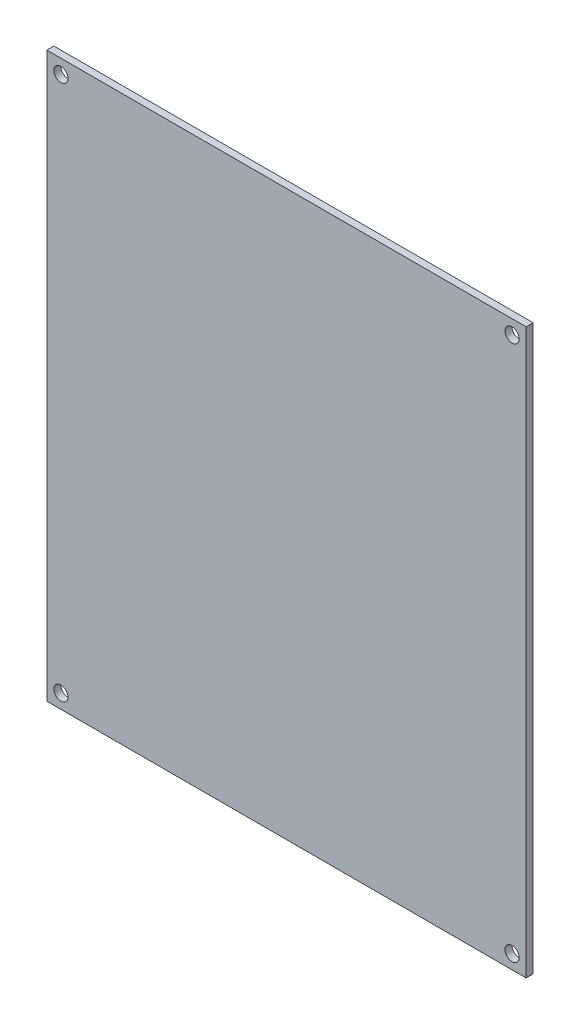
ISO-10303-21;
HEADER;
FILE_DESCRIPTION(('STEP AP214'),'2;1');
FILE_NAME('part.step','',(''),(''),'','','');
FILE_SCHEMA(('AUTOMOTIVE_DESIGN { 1 0 10303 214 1 1 1 1 }'));
ENDSEC;
DATA;
#1=APPLICATION_CONTEXT('core data for automotive mechanical design processes');
#2=APPLICATION_PROTOCOL_DEFINITION('international standard','automotive_design',2000,#1);
#3=PRODUCT_CONTEXT('',#1,'mechanical');
#4=PRODUCT('Part','Part','',(#3));
#5=PRODUCT_RELATED_PRODUCT_CATEGORY('part','',(#4));
#6=PRODUCT_DEFINITION_FORMATION('','',#4);
#7=PRODUCT_DEFINITION_CONTEXT('part definition',#1,'design');
#8=PRODUCT_DEFINITION('design','',#6,#7);
#9=PRODUCT_DEFINITION_SHAPE('','',#8);
#10=(LENGTH_UNIT() NAMED_UNIT(*) SI_UNIT(.MILLI.,.METRE.));
#11=(NAMED_UNIT(*) PLANE_ANGLE_UNIT() SI_UNIT($,.RADIAN.));
#12=(NAMED_UNIT(*) SI_UNIT($,.STERADIAN.) SOLID_ANGLE_UNIT());
#13=UNCERTAINTY_MEASURE_WITH_UNIT(LENGTH_MEASURE(1.E-05),#10,'distance_accuracy_value','');
#14=(GEOMETRIC_REPRESENTATION_CONTEXT(3) GLOBAL_UNCERTAINTY_ASSIGNED_CONTEXT((#13)) GLOBAL_UNIT_ASSIGNED_CONTEXT((#10,
#11,#12)) REPRESENTATION_CONTEXT('',''));
#15=CARTESIAN_POINT('',(0.,0.,0.));
#16=DIRECTION('',(0.,0.,1.));
#17=DIRECTION('',(1.,0.,0.));
#18=AXIS2_PLACEMENT_3D('',#15,#16,#17);
#19=CARTESIAN_POINT('',(0.,0.,0.));
#20=DIRECTION('',(0.,-1.,0.));
#21=DIRECTION('',(0.,0.,-1.));
#22=AXIS2_PLACEMENT_3D('',#19,#20,#21);
#23=PLANE('',#22);
#24=DIRECTION('',(1.,0.,0.));
#25=VECTOR('',#24,1.);
#26=CARTESIAN_POINT('',(0.,0.,1.5875));
#27=LINE('',#26,#25);
#28=CARTESIAN_POINT('',(0.,0.,1.5875));
#29=VERTEX_POINT('',#28);
#30=CARTESIAN_POINT('',(107.95,0.,1.5875));
#31=VERTEX_POINT('',#30);
#32=EDGE_CURVE('E98',#29,#31,#27,.T.);
#33=ORIENTED_EDGE('',*,*,#32,.F.);
#34=DIRECTION('',(0.,0.,1.));
#35=VECTOR('',#34,1.);
#36=CARTESIAN_POINT('',(0.,0.,0.));
#37=LINE('',#36,#35);
#38=CARTESIAN_POINT('',(0.,0.,0.));
#39=VERTEX_POINT('',#38);
#40=EDGE_CURVE('E11',#39,#29,#37,.T.);
#41=ORIENTED_EDGE('',*,*,#40,.F.);
#42=DIRECTION('',(1.,0.,0.));
#43=VECTOR('',#42,1.);
#44=CARTESIAN_POINT('',(0.,0.,0.));
#45=LINE('',#44,#43);
#46=CARTESIAN_POINT('',(107.95,0.,0.));
#47=VERTEX_POINT('',#46);
#48=EDGE_CURVE('E91',#39,#47,#45,.T.);
#49=ORIENTED_EDGE('',*,*,#48,.T.);
#50=DIRECTION('',(0.,0.,1.));
#51=VECTOR('',#50,1.);
#52=CARTESIAN_POINT('',(107.95,0.,0.));
#53=LINE('',#52,#51);
#54=EDGE_CURVE('E36',#47,#31,#53,.T.);
#55=ORIENTED_EDGE('',*,*,#54,.T.);
#56=EDGE_LOOP('',(#33,#41,#49,#55));
#57=FACE_BOUND('',#56,.T.);
#58=ADVANCED_FACE('F33',(#57),#23,.T.);
#59=CARTESIAN_POINT('',(0.,127.,0.));
#60=DIRECTION('',(-1.,0.,0.));
#61=DIRECTION('',(0.,-1.,0.));
#62=AXIS2_PLACEMENT_3D('',#59,#60,#61);
#63=PLANE('',#62);
#64=DIRECTION('',(0.,-1.,0.));
#65=VECTOR('',#64,1.);
#66=CARTESIAN_POINT('',(0.,127.,1.5875));
#67=LINE('',#66,#65);
#68=CARTESIAN_POINT('',(0.,127.,1.5875));
#69=VERTEX_POINT('',#68);
#70=EDGE_CURVE('E93',#69,#29,#67,.T.);
#71=ORIENTED_EDGE('',*,*,#70,.F.);
#72=DIRECTION('',(0.,0.,1.));
#73=VECTOR('',#72,1.);
#74=CARTESIAN_POINT('',(0.,127.,0.));
#75=LINE('',#74,#73);
#76=CARTESIAN_POINT('',(0.,127.,0.));
#77=VERTEX_POINT('',#76);
#78=EDGE_CURVE('E42',#77,#69,#75,.T.);
#79=ORIENTED_EDGE('',*,*,#78,.F.);
#80=DIRECTION('',(0.,-1.,0.));
#81=VECTOR('',#80,1.);
#82=CARTESIAN_POINT('',(0.,127.,0.));
#83=LINE('',#82,#81);
#84=EDGE_CURVE('E88',#77,#39,#83,.T.);
#85=ORIENTED_EDGE('',*,*,#84,.T.);
#86=ORIENTED_EDGE('',*,*,#40,.T.);
#87=EDGE_LOOP('',(#71,#79,#85,#86));
#88=FACE_BOUND('',#87,.T.);
#89=ADVANCED_FACE('F109',(#88),#63,.T.);
#90=CARTESIAN_POINT('',(107.95,127.,0.));
#91=DIRECTION('',(0.,1.,0.));
#92=DIRECTION('',(0.,0.,1.));
#93=AXIS2_PLACEMENT_3D('',#90,#91,#92);
#94=PLANE('',#93);
#95=DIRECTION('',(-1.,0.,0.));
#96=VECTOR('',#95,1.);
#97=CARTESIAN_POINT('',(107.95,127.,1.5875));
#98=LINE('',#97,#96);
#99=CARTESIAN_POINT('',(107.95,127.,1.5875));
#100=VERTEX_POINT('',#99);
#101=EDGE_CURVE('E83',#100,#69,#98,.T.);
#102=ORIENTED_EDGE('',*,*,#101,.F.);
#103=DIRECTION('',(0.,0.,1.));
#104=VECTOR('',#103,1.);
#105=CARTESIAN_POINT('',(107.95,127.,0.));
#106=LINE('',#105,#104);
#107=CARTESIAN_POINT('',(107.95,127.,0.));
#108=VERTEX_POINT('',#107);
#109=EDGE_CURVE('E78',#108,#100,#106,.T.);
#110=ORIENTED_EDGE('',*,*,#109,.F.);
#111=DIRECTION('',(-1.,0.,0.));
#112=VECTOR('',#111,1.);
#113=CARTESIAN_POINT('',(107.95,127.,0.));
#114=LINE('',#113,#112);
#115=EDGE_CURVE('E81',#108,#77,#114,.T.);
#116=ORIENTED_EDGE('',*,*,#115,.T.);
#117=ORIENTED_EDGE('',*,*,#78,.T.);
#118=EDGE_LOOP('',(#102,#110,#116,#117));
#119=FACE_BOUND('',#118,.T.);
#120=ADVANCED_FACE('F80',(#119),#94,.T.);
#121=CARTESIAN_POINT('',(107.95,0.,0.));
#122=DIRECTION('',(1.,0.,0.));
#123=DIRECTION('',(0.,0.,-1.));
#124=AXIS2_PLACEMENT_3D('',#121,#122,#123);
#125=PLANE('',#124);
#126=DIRECTION('',(0.,1.,0.));
#127=VECTOR('',#126,1.);
#128=CARTESIAN_POINT('',(107.95,0.,1.5875));
#129=LINE('',#128,#127);
#130=EDGE_CURVE('E101',#31,#100,#129,.T.);
#131=ORIENTED_EDGE('',*,*,#130,.F.);
#132=ORIENTED_EDGE('',*,*,#54,.F.);
#133=DIRECTION('',(0.,1.,0.));
#134=VECTOR('',#133,1.);
#135=CARTESIAN_POINT('',(107.95,0.,0.));
#136=LINE('',#135,#134);
#137=EDGE_CURVE('E87',#47,#108,#136,.T.);
#138=ORIENTED_EDGE('',*,*,#137,.T.);
#139=ORIENTED_EDGE('',*,*,#109,.T.);
#140=EDGE_LOOP('',(#131,#132,#138,#139));
#141=FACE_BOUND('',#140,.T.);
#142=ADVANCED_FACE('F90',(#141),#125,.T.);
#143=CARTESIAN_POINT('',(107.95,0.,0.));
#144=DIRECTION('',(0.,0.,1.));
#145=DIRECTION('',(1.,0.,0.));
#146=AXIS2_PLACEMENT_3D('',#143,#144,#145);
#147=PLANE('',#146);
#148=CARTESIAN_POINT('',(3.17499999999971,3.175,0.));
#149=DIRECTION('',(0.,0.,1.));
#150=DIRECTION('',(-1.,0.,0.));
#151=AXIS2_PLACEMENT_3D('',#148,#149,#150);
#152=CIRCLE('',#151,1.5875);
#153=CARTESIAN_POINT('',(1.58749999999971,3.175,0.));
#154=VERTEX_POINT('',#153);
#155=EDGE_CURVE('E150',#154,#154,#152,.T.);
#156=ORIENTED_EDGE('',*,*,#155,.T.);
#157=EDGE_LOOP('',(#156));
#158=FACE_BOUND('',#157,.T.);
#159=CARTESIAN_POINT('',(104.775,123.825,0.));
#160=DIRECTION('',(0.,0.,1.));
#161=DIRECTION('',(-1.,0.,0.));
#162=AXIS2_PLACEMENT_3D('',#159,#160,#161);
#163=CIRCLE('',#162,1.58749999999999);
#164=CARTESIAN_POINT('',(103.1875,123.825,0.));
#165=VERTEX_POINT('',#164);
#166=EDGE_CURVE('E158',#165,#165,#163,.T.);
#167=ORIENTED_EDGE('',*,*,#166,.T.);
#168=EDGE_LOOP('',(#167));
#169=FACE_BOUND('',#168,.T.);
#170=CARTESIAN_POINT('',(3.17499999999971,123.825,0.));
#171=DIRECTION('',(0.,0.,1.));
#172=DIRECTION('',(-1.,0.,0.));
#173=AXIS2_PLACEMENT_3D('',#170,#171,#172);
#174=CIRCLE('',#173,1.5875);
#175=CARTESIAN_POINT('',(1.58749999999971,123.825,0.));
#176=VERTEX_POINT('',#175);
#177=EDGE_CURVE('E164',#176,#176,#174,.T.);
#178=ORIENTED_EDGE('',*,*,#177,.T.);
#179=EDGE_LOOP('',(#178));
#180=FACE_BOUND('',#179,.T.);
#181=CARTESIAN_POINT('',(104.775,3.175,0.));
#182=DIRECTION('',(0.,0.,1.));
#183=DIRECTION('',(-1.,0.,0.));
#184=AXIS2_PLACEMENT_3D('',#181,#182,#183);
#185=CIRCLE('',#184,1.5875);
#186=CARTESIAN_POINT('',(103.1875,3.175,0.));
#187=VERTEX_POINT('',#186);
#188=EDGE_CURVE('E102',#187,#187,#185,.T.);
#189=ORIENTED_EDGE('',*,*,#188,.T.);
#190=EDGE_LOOP('',(#189));
#191=FACE_BOUND('',#190,.T.);
#192=ORIENTED_EDGE('',*,*,#48,.F.);
#193=ORIENTED_EDGE('',*,*,#84,.F.);
#194=ORIENTED_EDGE('',*,*,#115,.F.);
#195=ORIENTED_EDGE('',*,*,#137,.F.);
#196=EDGE_LOOP('',(#192,#193,#194,#195));
#197=FACE_BOUND('',#196,.T.);
#198=ADVANCED_FACE('F86',(#158,#169,#180,#191,#197),#147,.F.);
#199=CARTESIAN_POINT('',(107.95,0.,1.5875));
#200=DIRECTION('',(0.,0.,1.));
#201=DIRECTION('',(1.,0.,0.));
#202=AXIS2_PLACEMENT_3D('',#199,#200,#201);
#203=PLANE('',#202);
#204=CARTESIAN_POINT('',(3.17499999999971,3.175,1.5875));
#205=DIRECTION('',(0.,0.,1.));
#206=DIRECTION('',(-1.,0.,0.));
#207=AXIS2_PLACEMENT_3D('',#204,#205,#206);
#208=CIRCLE('',#207,1.5875);
#209=CARTESIAN_POINT('',(1.58749999999971,3.175,1.5875));
#210=VERTEX_POINT('',#209);
#211=EDGE_CURVE('E153',#210,#210,#208,.T.);
#212=ORIENTED_EDGE('',*,*,#211,.F.);
#213=EDGE_LOOP('',(#212));
#214=FACE_BOUND('',#213,.T.);
#215=CARTESIAN_POINT('',(104.775,123.825,1.5875));
#216=DIRECTION('',(0.,0.,1.));
#217=DIRECTION('',(-1.,0.,0.));
#218=AXIS2_PLACEMENT_3D('',#215,#216,#217);
#219=CIRCLE('',#218,1.58749999999999);
#220=CARTESIAN_POINT('',(103.1875,123.825,1.5875));
#221=VERTEX_POINT('',#220);
#222=EDGE_CURVE('E155',#221,#221,#219,.T.);
#223=ORIENTED_EDGE('',*,*,#222,.F.);
#224=EDGE_LOOP('',(#223));
#225=FACE_BOUND('',#224,.T.);
#226=CARTESIAN_POINT('',(3.17499999999971,123.825,1.5875));
#227=DIRECTION('',(0.,0.,1.));
#228=DIRECTION('',(-1.,0.,0.));
#229=AXIS2_PLACEMENT_3D('',#226,#227,#228);
#230=CIRCLE('',#229,1.5875);
#231=CARTESIAN_POINT('',(1.58749999999971,123.825,1.5875));
#232=VERTEX_POINT('',#231);
#233=EDGE_CURVE('E161',#232,#232,#230,.T.);
#234=ORIENTED_EDGE('',*,*,#233,.F.);
#235=EDGE_LOOP('',(#234));
#236=FACE_BOUND('',#235,.T.);
#237=CARTESIAN_POINT('',(104.775,3.175,1.5875));
#238=DIRECTION('',(0.,0.,1.));
#239=DIRECTION('',(-1.,0.,0.));
#240=AXIS2_PLACEMENT_3D('',#237,#238,#239);
#241=CIRCLE('',#240,1.5875);
#242=CARTESIAN_POINT('',(103.1875,3.175,1.5875));
#243=VERTEX_POINT('',#242);
#244=EDGE_CURVE('E167',#243,#243,#241,.T.);
#245=ORIENTED_EDGE('',*,*,#244,.F.);
#246=EDGE_LOOP('',(#245));
#247=FACE_BOUND('',#246,.T.);
#248=ORIENTED_EDGE('',*,*,#32,.T.);
#249=ORIENTED_EDGE('',*,*,#130,.T.);
#250=ORIENTED_EDGE('',*,*,#101,.T.);
#251=ORIENTED_EDGE('',*,*,#70,.T.);
#252=EDGE_LOOP('',(#248,#249,#250,#251));
#253=FACE_BOUND('',#252,.T.);
#254=ADVANCED_FACE('F108',(#214,#225,#236,#247,#253),#203,.T.);
#255=CARTESIAN_POINT('',(104.775,3.175,0.));
#256=DIRECTION('',(0.,0.,1.));
#257=DIRECTION('',(1.,0.,0.));
#258=AXIS2_PLACEMENT_3D('',#255,#256,#257);
#259=CYLINDRICAL_SURFACE('',#258,1.5875);
#260=ORIENTED_EDGE('',*,*,#188,.F.);
#261=EDGE_LOOP('',(#260));
#262=FACE_BOUND('',#261,.T.);
#263=ORIENTED_EDGE('',*,*,#244,.T.);
#264=EDGE_LOOP('',(#263));
#265=FACE_BOUND('',#264,.T.);
#266=ADVANCED_FACE('F127',(#262,#265),#259,.F.);
#267=CARTESIAN_POINT('',(3.17499999999971,123.825,0.));
#268=DIRECTION('',(0.,0.,1.));
#269=DIRECTION('',(1.,0.,0.));
#270=AXIS2_PLACEMENT_3D('',#267,#268,#269);
#271=CYLINDRICAL_SURFACE('',#270,1.5875);
#272=ORIENTED_EDGE('',*,*,#177,.F.);
#273=EDGE_LOOP('',(#272));
#274=FACE_BOUND('',#273,.T.);
#275=ORIENTED_EDGE('',*,*,#233,.T.);
#276=EDGE_LOOP('',(#275));
#277=FACE_BOUND('',#276,.T.);
#278=ADVANCED_FACE('F134',(#274,#277),#271,.F.);
#279=CARTESIAN_POINT('',(104.775,123.825,0.));
#280=DIRECTION('',(0.,0.,1.));
#281=DIRECTION('',(1.,0.,0.));
#282=AXIS2_PLACEMENT_3D('',#279,#280,#281);
#283=CYLINDRICAL_SURFACE('',#282,1.58749999999999);
#284=ORIENTED_EDGE('',*,*,#166,.F.);
#285=EDGE_LOOP('',(#284));
#286=FACE_BOUND('',#285,.T.);
#287=ORIENTED_EDGE('',*,*,#222,.T.);
#288=EDGE_LOOP('',(#287));
#289=FACE_BOUND('',#288,.T.);
#290=ADVANCED_FACE('F138',(#286,#289),#283,.F.);
#291=CARTESIAN_POINT('',(3.17499999999971,3.175,0.));
#292=DIRECTION('',(0.,0.,1.));
#293=DIRECTION('',(1.,0.,0.));
#294=AXIS2_PLACEMENT_3D('',#291,#292,#293);
#295=CYLINDRICAL_SURFACE('',#294,1.5875);
#296=ORIENTED_EDGE('',*,*,#155,.F.);
#297=EDGE_LOOP('',(#296));
#298=FACE_BOUND('',#297,.T.);
#299=ORIENTED_EDGE('',*,*,#211,.T.);
#300=EDGE_LOOP('',(#299));
#301=FACE_BOUND('',#300,.T.);
#302=ADVANCED_FACE('F142',(#298,#301),#295,.F.);
#303=CLOSED_SHELL('',(#58,#89,#120,#142,#198,#254,#266,#278,#290,#302));
#304=MANIFOLD_SOLID_BREP('B2',#303);
#305=ADVANCED_BREP_SHAPE_REPRESENTATION('',(#18,#304),#14);
#306=SHAPE_DEFINITION_REPRESENTATION(#9,#305);
ENDSEC;
END-ISO-10303-21;
